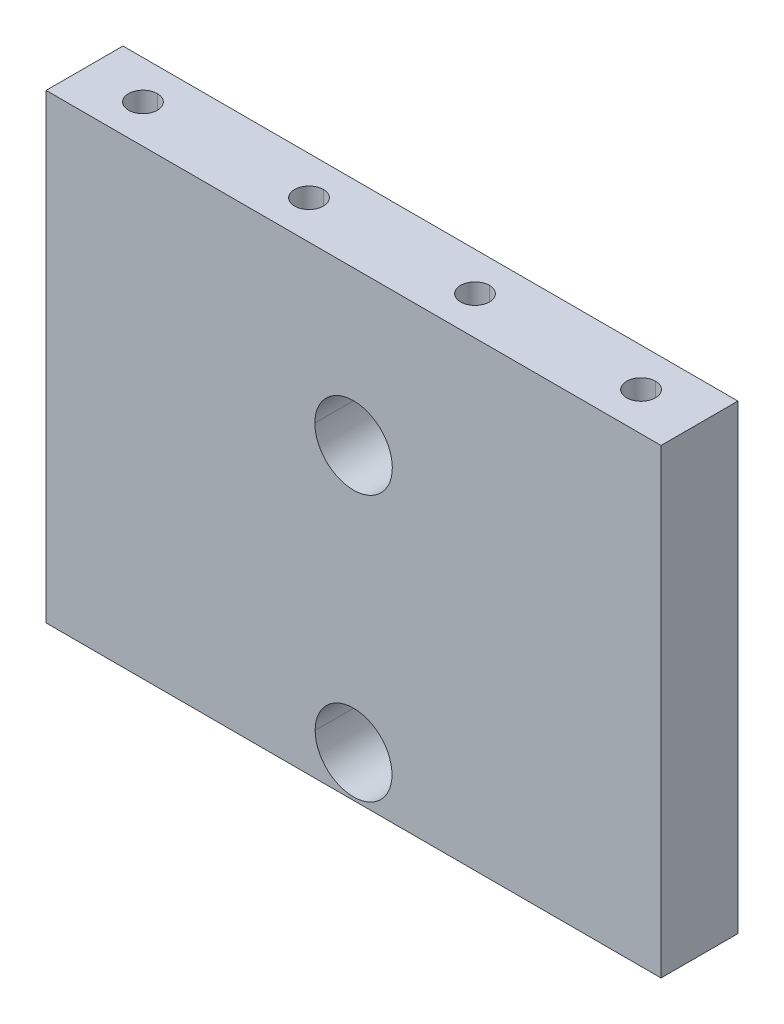
ISO-10303-21;
HEADER;
FILE_DESCRIPTION(('STEP AP214'),'2;1');
FILE_NAME('part.step','',(''),(''),'','','');
FILE_SCHEMA(('AUTOMOTIVE_DESIGN { 1 0 10303 214 1 1 1 1 }'));
ENDSEC;
DATA;
#1=APPLICATION_CONTEXT('core data for automotive mechanical design processes');
#2=APPLICATION_PROTOCOL_DEFINITION('international standard','automotive_design',2000,#1);
#3=PRODUCT_CONTEXT('',#1,'mechanical');
#4=PRODUCT('Part','Part','',(#3));
#5=PRODUCT_RELATED_PRODUCT_CATEGORY('part','',(#4));
#6=PRODUCT_DEFINITION_FORMATION('','',#4);
#7=PRODUCT_DEFINITION_CONTEXT('part definition',#1,'design');
#8=PRODUCT_DEFINITION('design','',#6,#7);
#9=PRODUCT_DEFINITION_SHAPE('','',#8);
#10=(LENGTH_UNIT() NAMED_UNIT(*) SI_UNIT(.MILLI.,.METRE.));
#11=(NAMED_UNIT(*) PLANE_ANGLE_UNIT() SI_UNIT($,.RADIAN.));
#12=(NAMED_UNIT(*) SI_UNIT($,.STERADIAN.) SOLID_ANGLE_UNIT());
#13=UNCERTAINTY_MEASURE_WITH_UNIT(LENGTH_MEASURE(1.E-05),#10,'distance_accuracy_value','');
#14=(GEOMETRIC_REPRESENTATION_CONTEXT(3) GLOBAL_UNCERTAINTY_ASSIGNED_CONTEXT((#13)) GLOBAL_UNIT_ASSIGNED_CONTEXT((#10,
#11,#12)) REPRESENTATION_CONTEXT('',''));
#15=CARTESIAN_POINT('',(0.,0.,0.));
#16=DIRECTION('',(0.,0.,1.));
#17=DIRECTION('',(1.,0.,0.));
#18=AXIS2_PLACEMENT_3D('',#15,#16,#17);
#19=CARTESIAN_POINT('',(0.,-7.8105,1.5875));
#20=DIRECTION('',(0.,0.,1.));
#21=DIRECTION('',(1.,0.,0.));
#22=AXIS2_PLACEMENT_3D('',#19,#20,#21);
#23=CYLINDRICAL_SURFACE('',#22,1.5875);
#24=CARTESIAN_POINT('',(0.,-7.8105,-1.5875));
#25=DIRECTION('',(0.,0.,1.));
#26=DIRECTION('',(1.,0.,0.));
#27=AXIS2_PLACEMENT_3D('',#24,#25,#26);
#28=CIRCLE('',#27,1.5875);
#29=CARTESIAN_POINT('',(-1.5875,-7.8105,-1.5875));
#30=VERTEX_POINT('',#29);
#31=CARTESIAN_POINT('',(1.5875,-7.8105,-1.5875));
#32=VERTEX_POINT('',#31);
#33=EDGE_CURVE('E41',#30,#32,#28,.T.);
#34=ORIENTED_EDGE('',*,*,#33,.F.);
#35=DIRECTION('',(0.,0.,1.));
#36=VECTOR('',#35,1.);
#37=CARTESIAN_POINT('',(-1.5875,-7.8105,1.5875));
#38=LINE('',#37,#36);
#39=CARTESIAN_POINT('',(-1.5875,-7.8105,1.5875));
#40=VERTEX_POINT('',#39);
#41=EDGE_CURVE('E11',#30,#40,#38,.T.);
#42=ORIENTED_EDGE('',*,*,#41,.T.);
#43=CARTESIAN_POINT('',(0.,-7.8105,1.5875));
#44=DIRECTION('',(0.,0.,1.));
#45=DIRECTION('',(1.,0.,0.));
#46=AXIS2_PLACEMENT_3D('',#43,#44,#45);
#47=CIRCLE('',#46,1.5875);
#48=CARTESIAN_POINT('',(1.5875,-7.8105,1.5875));
#49=VERTEX_POINT('',#48);
#50=EDGE_CURVE('E27',#40,#49,#47,.T.);
#51=ORIENTED_EDGE('',*,*,#50,.T.);
#52=DIRECTION('',(0.,0.,1.));
#53=VECTOR('',#52,1.);
#54=CARTESIAN_POINT('',(1.5875,-7.8105,1.5875));
#55=LINE('',#54,#53);
#56=EDGE_CURVE('E405',#32,#49,#55,.T.);
#57=ORIENTED_EDGE('',*,*,#56,.F.);
#58=EDGE_LOOP('',(#34,#42,#51,#57));
#59=FACE_BOUND('',#58,.T.);
#60=ADVANCED_FACE('F17',(#59),#23,.F.);
#61=CARTESIAN_POINT('',(-10.287,-9.525,0.));
#62=DIRECTION('',(0.,-1.,0.));
#63=DIRECTION('',(0.,0.,-1.));
#64=AXIS2_PLACEMENT_3D('',#61,#62,#63);
#65=CYLINDRICAL_SURFACE('',#64,0.59563);
#66=CARTESIAN_POINT('',(-10.287,-5.5118,0.));
#67=DIRECTION('',(0.,-1.,0.));
#68=DIRECTION('',(0.,0.,-1.));
#69=AXIS2_PLACEMENT_3D('',#66,#67,#68);
#70=CIRCLE('',#69,0.59563);
#71=CARTESIAN_POINT('',(-10.287,-5.5118,0.59563));
#72=VERTEX_POINT('',#71);
#73=CARTESIAN_POINT('',(-10.287,-5.5118,-0.59563));
#74=VERTEX_POINT('',#73);
#75=EDGE_CURVE('E421',#72,#74,#70,.T.);
#76=ORIENTED_EDGE('',*,*,#75,.F.);
#77=DIRECTION('',(0.,-1.,0.));
#78=VECTOR('',#77,1.);
#79=CARTESIAN_POINT('',(-10.287,-9.525,0.59563));
#80=LINE('',#79,#78);
#81=CARTESIAN_POINT('',(-10.287,-9.525,0.59563));
#82=VERTEX_POINT('',#81);
#83=EDGE_CURVE('E344',#72,#82,#80,.T.);
#84=ORIENTED_EDGE('',*,*,#83,.T.);
#85=CARTESIAN_POINT('',(-10.287,-9.525,0.));
#86=DIRECTION('',(0.,-1.,0.));
#87=DIRECTION('',(0.,0.,-1.));
#88=AXIS2_PLACEMENT_3D('',#85,#86,#87);
#89=CIRCLE('',#88,0.59563);
#90=CARTESIAN_POINT('',(-10.287,-9.525,-0.59563));
#91=VERTEX_POINT('',#90);
#92=EDGE_CURVE('E532',#82,#91,#89,.T.);
#93=ORIENTED_EDGE('',*,*,#92,.T.);
#94=DIRECTION('',(0.,-1.,0.));
#95=VECTOR('',#94,1.);
#96=CARTESIAN_POINT('',(-10.287,-9.525,-0.59563));
#97=LINE('',#96,#95);
#98=EDGE_CURVE('E572',#74,#91,#97,.T.);
#99=ORIENTED_EDGE('',*,*,#98,.F.);
#100=EDGE_LOOP('',(#76,#84,#93,#99));
#101=FACE_BOUND('',#100,.T.);
#102=ADVANCED_FACE('F644',(#101),#65,.F.);
#103=CARTESIAN_POINT('',(-10.287,-5.5118,0.));
#104=DIRECTION('',(0.,-1.,0.));
#105=DIRECTION('',(0.,0.,-1.));
#106=AXIS2_PLACEMENT_3D('',#103,#104,#105);
#107=CONICAL_SURFACE('',#106,0.59563,1.02974425867665);
#108=DIRECTION('',(0.,-0.515038074910057,-0.857167300702111));
#109=VECTOR('',#108,1.);
#110=CARTESIAN_POINT('',(-10.287,-5.5118,-0.59563));
#111=LINE('',#110,#109);
#112=CARTESIAN_POINT('',(-10.287,-5.15390938948862,0.));
#113=VERTEX_POINT('',#112);
#114=EDGE_CURVE('E248',#113,#74,#111,.T.);
#115=ORIENTED_EDGE('',*,*,#114,.F.);
#116=DIRECTION('',(0.,-0.515038074910057,0.857167300702111));
#117=VECTOR('',#116,1.);
#118=CARTESIAN_POINT('',(-10.287,-5.5118,0.59563));
#119=LINE('',#118,#117);
#120=EDGE_CURVE('E479',#113,#72,#119,.T.);
#121=ORIENTED_EDGE('',*,*,#120,.T.);
#122=ORIENTED_EDGE('',*,*,#75,.T.);
#123=EDGE_LOOP('',(#115,#121,#122));
#124=FACE_BOUND('',#123,.T.);
#125=ADVANCED_FACE('F649',(#124),#107,.F.);
#126=CARTESIAN_POINT('',(-3.429,-9.525,0.));
#127=DIRECTION('',(0.,-1.,0.));
#128=DIRECTION('',(0.,0.,-1.));
#129=AXIS2_PLACEMENT_3D('',#126,#127,#128);
#130=CYLINDRICAL_SURFACE('',#129,0.59563);
#131=CARTESIAN_POINT('',(-3.429,-5.5118,0.));
#132=DIRECTION('',(0.,-1.,0.));
#133=DIRECTION('',(0.,0.,-1.));
#134=AXIS2_PLACEMENT_3D('',#131,#132,#133);
#135=CIRCLE('',#134,0.59563);
#136=CARTESIAN_POINT('',(-3.429,-5.5118,0.59563));
#137=VERTEX_POINT('',#136);
#138=CARTESIAN_POINT('',(-3.429,-5.5118,-0.59563));
#139=VERTEX_POINT('',#138);
#140=EDGE_CURVE('E264',#137,#139,#135,.T.);
#141=ORIENTED_EDGE('',*,*,#140,.F.);
#142=DIRECTION('',(0.,-1.,0.));
#143=VECTOR('',#142,1.);
#144=CARTESIAN_POINT('',(-3.429,-9.525,0.59563));
#145=LINE('',#144,#143);
#146=CARTESIAN_POINT('',(-3.429,-9.525,0.59563));
#147=VERTEX_POINT('',#146);
#148=EDGE_CURVE('E418',#137,#147,#145,.T.);
#149=ORIENTED_EDGE('',*,*,#148,.T.);
#150=CARTESIAN_POINT('',(-3.429,-9.525,0.));
#151=DIRECTION('',(0.,-1.,0.));
#152=DIRECTION('',(0.,0.,-1.));
#153=AXIS2_PLACEMENT_3D('',#150,#151,#152);
#154=CIRCLE('',#153,0.59563);
#155=CARTESIAN_POINT('',(-3.429,-9.525,-0.59563));
#156=VERTEX_POINT('',#155);
#157=EDGE_CURVE('E422',#147,#156,#154,.T.);
#158=ORIENTED_EDGE('',*,*,#157,.T.);
#159=DIRECTION('',(0.,-1.,0.));
#160=VECTOR('',#159,1.);
#161=CARTESIAN_POINT('',(-3.429,-9.525,-0.59563));
#162=LINE('',#161,#160);
#163=EDGE_CURVE('E437',#139,#156,#162,.T.);
#164=ORIENTED_EDGE('',*,*,#163,.F.);
#165=EDGE_LOOP('',(#141,#149,#158,#164));
#166=FACE_BOUND('',#165,.T.);
#167=ADVANCED_FACE('F656',(#166),#130,.F.);
#168=CARTESIAN_POINT('',(-3.429,-5.5118,0.));
#169=DIRECTION('',(0.,-1.,0.));
#170=DIRECTION('',(0.,0.,-1.));
#171=AXIS2_PLACEMENT_3D('',#168,#169,#170);
#172=CONICAL_SURFACE('',#171,0.59563,1.02974425867665);
#173=DIRECTION('',(0.,-0.515038074910056,-0.857167300702111));
#174=VECTOR('',#173,1.);
#175=CARTESIAN_POINT('',(-3.429,-5.5118,-0.59563));
#176=LINE('',#175,#174);
#177=CARTESIAN_POINT('',(-3.429,-5.15390938948862,0.));
#178=VERTEX_POINT('',#177);
#179=EDGE_CURVE('E476',#178,#139,#176,.T.);
#180=ORIENTED_EDGE('',*,*,#179,.F.);
#181=DIRECTION('',(0.,-0.515038074910056,0.857167300702111));
#182=VECTOR('',#181,1.);
#183=CARTESIAN_POINT('',(-3.429,-5.5118,0.59563));
#184=LINE('',#183,#182);
#185=EDGE_CURVE('E508',#178,#137,#184,.T.);
#186=ORIENTED_EDGE('',*,*,#185,.T.);
#187=ORIENTED_EDGE('',*,*,#140,.T.);
#188=EDGE_LOOP('',(#180,#186,#187));
#189=FACE_BOUND('',#188,.T.);
#190=ADVANCED_FACE('F717',(#189),#172,.F.);
#191=CARTESIAN_POINT('',(3.429,-9.525,0.));
#192=DIRECTION('',(0.,-1.,0.));
#193=DIRECTION('',(0.,0.,-1.));
#194=AXIS2_PLACEMENT_3D('',#191,#192,#193);
#195=CYLINDRICAL_SURFACE('',#194,0.59563);
#196=CARTESIAN_POINT('',(3.429,-5.5118,0.));
#197=DIRECTION('',(0.,-1.,0.));
#198=DIRECTION('',(0.,0.,-1.));
#199=AXIS2_PLACEMENT_3D('',#196,#197,#198);
#200=CIRCLE('',#199,0.59563);
#201=CARTESIAN_POINT('',(3.429,-5.5118,0.59563));
#202=VERTEX_POINT('',#201);
#203=CARTESIAN_POINT('',(3.429,-5.5118,-0.59563));
#204=VERTEX_POINT('',#203);
#205=EDGE_CURVE('E536',#202,#204,#200,.T.);
#206=ORIENTED_EDGE('',*,*,#205,.F.);
#207=DIRECTION('',(0.,-1.,0.));
#208=VECTOR('',#207,1.);
#209=CARTESIAN_POINT('',(3.429,-9.525,0.59563));
#210=LINE('',#209,#208);
#211=CARTESIAN_POINT('',(3.429,-9.525,0.59563));
#212=VERTEX_POINT('',#211);
#213=EDGE_CURVE('E509',#202,#212,#210,.T.);
#214=ORIENTED_EDGE('',*,*,#213,.T.);
#215=CARTESIAN_POINT('',(3.429,-9.525,0.));
#216=DIRECTION('',(0.,-1.,0.));
#217=DIRECTION('',(0.,0.,-1.));
#218=AXIS2_PLACEMENT_3D('',#215,#216,#217);
#219=CIRCLE('',#218,0.59563);
#220=CARTESIAN_POINT('',(3.429,-9.525,-0.59563));
#221=VERTEX_POINT('',#220);
#222=EDGE_CURVE('E20',#212,#221,#219,.T.);
#223=ORIENTED_EDGE('',*,*,#222,.T.);
#224=DIRECTION('',(0.,-1.,0.));
#225=VECTOR('',#224,1.);
#226=CARTESIAN_POINT('',(3.429,-9.525,-0.59563));
#227=LINE('',#226,#225);
#228=EDGE_CURVE('E152',#204,#221,#227,.T.);
#229=ORIENTED_EDGE('',*,*,#228,.F.);
#230=EDGE_LOOP('',(#206,#214,#223,#229));
#231=FACE_BOUND('',#230,.T.);
#232=ADVANCED_FACE('F601',(#231),#195,.F.);
#233=CARTESIAN_POINT('',(3.429,-5.5118,0.));
#234=DIRECTION('',(0.,-1.,0.));
#235=DIRECTION('',(0.,0.,-1.));
#236=AXIS2_PLACEMENT_3D('',#233,#234,#235);
#237=CONICAL_SURFACE('',#236,0.59563,1.02974425867665);
#238=DIRECTION('',(0.,-0.515038074910056,-0.857167300702111));
#239=VECTOR('',#238,1.);
#240=CARTESIAN_POINT('',(3.429,-5.5118,-0.59563));
#241=LINE('',#240,#239);
#242=CARTESIAN_POINT('',(3.429,-5.15390938948862,0.));
#243=VERTEX_POINT('',#242);
#244=EDGE_CURVE('E582',#243,#204,#241,.T.);
#245=ORIENTED_EDGE('',*,*,#244,.F.);
#246=DIRECTION('',(0.,-0.515038074910056,0.857167300702111));
#247=VECTOR('',#246,1.);
#248=CARTESIAN_POINT('',(3.429,-5.5118,0.59563));
#249=LINE('',#248,#247);
#250=EDGE_CURVE('E533',#243,#202,#249,.T.);
#251=ORIENTED_EDGE('',*,*,#250,.T.);
#252=ORIENTED_EDGE('',*,*,#205,.T.);
#253=EDGE_LOOP('',(#245,#251,#252));
#254=FACE_BOUND('',#253,.T.);
#255=ADVANCED_FACE('F716',(#254),#237,.F.);
#256=CARTESIAN_POINT('',(10.287,-9.525,0.));
#257=DIRECTION('',(0.,-1.,0.));
#258=DIRECTION('',(0.,0.,-1.));
#259=AXIS2_PLACEMENT_3D('',#256,#257,#258);
#260=CYLINDRICAL_SURFACE('',#259,0.59563);
#261=CARTESIAN_POINT('',(10.287,-5.5118,0.));
#262=DIRECTION('',(0.,-1.,0.));
#263=DIRECTION('',(0.,0.,-1.));
#264=AXIS2_PLACEMENT_3D('',#261,#262,#263);
#265=CIRCLE('',#264,0.59563);
#266=CARTESIAN_POINT('',(10.287,-5.5118,0.59563));
#267=VERTEX_POINT('',#266);
#268=CARTESIAN_POINT('',(10.287,-5.5118,-0.59563));
#269=VERTEX_POINT('',#268);
#270=EDGE_CURVE('E349',#267,#269,#265,.T.);
#271=ORIENTED_EDGE('',*,*,#270,.F.);
#272=DIRECTION('',(0.,-1.,0.));
#273=VECTOR('',#272,1.);
#274=CARTESIAN_POINT('',(10.287,-9.525,0.59563));
#275=LINE('',#274,#273);
#276=CARTESIAN_POINT('',(10.287,-9.525,0.59563));
#277=VERTEX_POINT('',#276);
#278=EDGE_CURVE('E524',#267,#277,#275,.T.);
#279=ORIENTED_EDGE('',*,*,#278,.T.);
#280=CARTESIAN_POINT('',(10.287,-9.525,0.));
#281=DIRECTION('',(0.,-1.,0.));
#282=DIRECTION('',(0.,0.,-1.));
#283=AXIS2_PLACEMENT_3D('',#280,#281,#282);
#284=CIRCLE('',#283,0.59563);
#285=CARTESIAN_POINT('',(10.287,-9.525,-0.59563));
#286=VERTEX_POINT('',#285);
#287=EDGE_CURVE('E520',#277,#286,#284,.T.);
#288=ORIENTED_EDGE('',*,*,#287,.T.);
#289=DIRECTION('',(0.,-1.,0.));
#290=VECTOR('',#289,1.);
#291=CARTESIAN_POINT('',(10.287,-9.525,-0.59563));
#292=LINE('',#291,#290);
#293=EDGE_CURVE('E381',#269,#286,#292,.T.);
#294=ORIENTED_EDGE('',*,*,#293,.F.);
#295=EDGE_LOOP('',(#271,#279,#288,#294));
#296=FACE_BOUND('',#295,.T.);
#297=ADVANCED_FACE('F621',(#296),#260,.F.);
#298=CARTESIAN_POINT('',(10.287,-5.5118,0.));
#299=DIRECTION('',(0.,-1.,0.));
#300=DIRECTION('',(0.,0.,-1.));
#301=AXIS2_PLACEMENT_3D('',#298,#299,#300);
#302=CONICAL_SURFACE('',#301,0.59563,1.02974425867665);
#303=DIRECTION('',(0.,-0.515038074910057,-0.857167300702111));
#304=VECTOR('',#303,1.);
#305=CARTESIAN_POINT('',(10.287,-5.5118,-0.59563));
#306=LINE('',#305,#304);
#307=CARTESIAN_POINT('',(10.287,-5.15390938948862,0.));
#308=VERTEX_POINT('',#307);
#309=EDGE_CURVE('E380',#308,#269,#306,.T.);
#310=ORIENTED_EDGE('',*,*,#309,.F.);
#311=DIRECTION('',(0.,-0.515038074910057,0.857167300702111));
#312=VECTOR('',#311,1.);
#313=CARTESIAN_POINT('',(10.287,-5.5118,0.59563));
#314=LINE('',#313,#312);
#315=EDGE_CURVE('E394',#308,#267,#314,.T.);
#316=ORIENTED_EDGE('',*,*,#315,.T.);
#317=ORIENTED_EDGE('',*,*,#270,.T.);
#318=EDGE_LOOP('',(#310,#316,#317));
#319=FACE_BOUND('',#318,.T.);
#320=ADVANCED_FACE('F624',(#319),#302,.F.);
#321=CARTESIAN_POINT('',(0.,3.175,-1.5875));
#322=DIRECTION('',(0.,0.,1.));
#323=DIRECTION('',(1.,0.,0.));
#324=AXIS2_PLACEMENT_3D('',#321,#322,#323);
#325=CYLINDRICAL_SURFACE('',#324,1.6002);
#326=CARTESIAN_POINT('',(0.,3.175,-1.5875));
#327=DIRECTION('',(0.,0.,1.));
#328=DIRECTION('',(1.,0.,0.));
#329=AXIS2_PLACEMENT_3D('',#326,#327,#328);
#330=CIRCLE('',#329,1.6002);
#331=CARTESIAN_POINT('',(-1.6002,3.175,-1.5875));
#332=VERTEX_POINT('',#331);
#333=CARTESIAN_POINT('',(1.6002,3.175,-1.5875));
#334=VERTEX_POINT('',#333);
#335=EDGE_CURVE('E395',#332,#334,#330,.T.);
#336=ORIENTED_EDGE('',*,*,#335,.F.);
#337=DIRECTION('',(0.,0.,1.));
#338=VECTOR('',#337,1.);
#339=CARTESIAN_POINT('',(-1.6002,3.175,-1.5875));
#340=LINE('',#339,#338);
#341=CARTESIAN_POINT('',(-1.6002,3.175,1.5875));
#342=VERTEX_POINT('',#341);
#343=EDGE_CURVE('E345',#332,#342,#340,.T.);
#344=ORIENTED_EDGE('',*,*,#343,.T.);
#345=CARTESIAN_POINT('',(0.,3.175,1.5875));
#346=DIRECTION('',(0.,0.,1.));
#347=DIRECTION('',(1.,0.,0.));
#348=AXIS2_PLACEMENT_3D('',#345,#346,#347);
#349=CIRCLE('',#348,1.6002);
#350=CARTESIAN_POINT('',(1.6002,3.175,1.5875));
#351=VERTEX_POINT('',#350);
#352=EDGE_CURVE('E350',#342,#351,#349,.T.);
#353=ORIENTED_EDGE('',*,*,#352,.T.);
#354=DIRECTION('',(0.,0.,1.));
#355=VECTOR('',#354,1.);
#356=CARTESIAN_POINT('',(1.6002,3.175,-1.5875));
#357=LINE('',#356,#355);
#358=EDGE_CURVE('E382',#334,#351,#357,.T.);
#359=ORIENTED_EDGE('',*,*,#358,.F.);
#360=EDGE_LOOP('',(#336,#344,#353,#359));
#361=FACE_BOUND('',#360,.T.);
#362=ADVANCED_FACE('F662',(#361),#325,.F.);
#363=CARTESIAN_POINT('',(-10.287,9.525,0.));
#364=DIRECTION('',(0.,1.,0.));
#365=DIRECTION('',(0.,0.,1.));
#366=AXIS2_PLACEMENT_3D('',#363,#364,#365);
#367=CYLINDRICAL_SURFACE('',#366,0.59563);
#368=CARTESIAN_POINT('',(-10.287,5.5118,0.));
#369=DIRECTION('',(0.,1.,0.));
#370=DIRECTION('',(0.,0.,1.));
#371=AXIS2_PLACEMENT_3D('',#368,#369,#370);
#372=CIRCLE('',#371,0.59563);
#373=CARTESIAN_POINT('',(-10.287,5.5118,-0.59563));
#374=VERTEX_POINT('',#373);
#375=CARTESIAN_POINT('',(-10.287,5.5118,0.59563));
#376=VERTEX_POINT('',#375);
#377=EDGE_CURVE('E530',#374,#376,#372,.T.);
#378=ORIENTED_EDGE('',*,*,#377,.F.);
#379=DIRECTION('',(0.,1.,0.));
#380=VECTOR('',#379,1.);
#381=CARTESIAN_POINT('',(-10.287,9.525,-0.59563));
#382=LINE('',#381,#380);
#383=CARTESIAN_POINT('',(-10.287,9.525,-0.59563));
#384=VERTEX_POINT('',#383);
#385=EDGE_CURVE('E340',#374,#384,#382,.T.);
#386=ORIENTED_EDGE('',*,*,#385,.T.);
#387=CARTESIAN_POINT('',(-10.287,9.525,0.));
#388=DIRECTION('',(0.,1.,0.));
#389=DIRECTION('',(0.,0.,1.));
#390=AXIS2_PLACEMENT_3D('',#387,#388,#389);
#391=CIRCLE('',#390,0.59563);
#392=CARTESIAN_POINT('',(-10.287,9.525,0.59563));
#393=VERTEX_POINT('',#392);
#394=EDGE_CURVE('E529',#384,#393,#391,.T.);
#395=ORIENTED_EDGE('',*,*,#394,.T.);
#396=DIRECTION('',(0.,1.,0.));
#397=VECTOR('',#396,1.);
#398=CARTESIAN_POINT('',(-10.287,9.525,0.59563));
#399=LINE('',#398,#397);
#400=EDGE_CURVE('E448',#376,#393,#399,.T.);
#401=ORIENTED_EDGE('',*,*,#400,.F.);
#402=EDGE_LOOP('',(#378,#386,#395,#401));
#403=FACE_BOUND('',#402,.T.);
#404=ADVANCED_FACE('F665',(#403),#367,.F.);
#405=CARTESIAN_POINT('',(-10.287,5.5118,0.));
#406=DIRECTION('',(0.,1.,0.));
#407=DIRECTION('',(0.,0.,1.));
#408=AXIS2_PLACEMENT_3D('',#405,#406,#407);
#409=CONICAL_SURFACE('',#408,0.59563,1.02974425867665);
#410=DIRECTION('',(0.,0.515038074910057,0.857167300702111));
#411=VECTOR('',#410,1.);
#412=CARTESIAN_POINT('',(-10.287,5.5118,0.59563));
#413=LINE('',#412,#411);
#414=CARTESIAN_POINT('',(-10.287,5.15390938948861,0.));
#415=VERTEX_POINT('',#414);
#416=EDGE_CURVE('E447',#415,#376,#413,.T.);
#417=ORIENTED_EDGE('',*,*,#416,.F.);
#418=DIRECTION('',(0.,0.515038074910057,-0.857167300702111));
#419=VECTOR('',#418,1.);
#420=CARTESIAN_POINT('',(-10.287,5.5118,-0.59563));
#421=LINE('',#420,#419);
#422=EDGE_CURVE('E525',#415,#374,#421,.T.);
#423=ORIENTED_EDGE('',*,*,#422,.T.);
#424=ORIENTED_EDGE('',*,*,#377,.T.);
#425=EDGE_LOOP('',(#417,#423,#424));
#426=FACE_BOUND('',#425,.T.);
#427=ADVANCED_FACE('F667',(#426),#409,.F.);
#428=CARTESIAN_POINT('',(-3.429,9.525,0.));
#429=DIRECTION('',(0.,1.,0.));
#430=DIRECTION('',(0.,0.,1.));
#431=AXIS2_PLACEMENT_3D('',#428,#429,#430);
#432=CYLINDRICAL_SURFACE('',#431,0.59563);
#433=CARTESIAN_POINT('',(-3.429,5.5118,0.));
#434=DIRECTION('',(0.,1.,0.));
#435=DIRECTION('',(0.,0.,1.));
#436=AXIS2_PLACEMENT_3D('',#433,#434,#435);
#437=CIRCLE('',#436,0.59563);
#438=CARTESIAN_POINT('',(-3.429,5.5118,-0.59563));
#439=VERTEX_POINT('',#438);
#440=CARTESIAN_POINT('',(-3.429,5.5118,0.59563));
#441=VERTEX_POINT('',#440);
#442=EDGE_CURVE('E324',#439,#441,#437,.T.);
#443=ORIENTED_EDGE('',*,*,#442,.F.);
#444=DIRECTION('',(0.,1.,0.));
#445=VECTOR('',#444,1.);
#446=CARTESIAN_POINT('',(-3.429,9.525,-0.59563));
#447=LINE('',#446,#445);
#448=CARTESIAN_POINT('',(-3.429,9.525,-0.59563));
#449=VERTEX_POINT('',#448);
#450=EDGE_CURVE('E370',#439,#449,#447,.T.);
#451=ORIENTED_EDGE('',*,*,#450,.T.);
#452=CARTESIAN_POINT('',(-3.429,9.525,0.));
#453=DIRECTION('',(0.,1.,0.));
#454=DIRECTION('',(0.,0.,1.));
#455=AXIS2_PLACEMENT_3D('',#452,#453,#454);
#456=CIRCLE('',#455,0.59563);
#457=CARTESIAN_POINT('',(-3.429,9.525,0.59563));
#458=VERTEX_POINT('',#457);
#459=EDGE_CURVE('E366',#449,#458,#456,.T.);
#460=ORIENTED_EDGE('',*,*,#459,.T.);
#461=DIRECTION('',(0.,1.,0.));
#462=VECTOR('',#461,1.);
#463=CARTESIAN_POINT('',(-3.429,9.525,0.59563));
#464=LINE('',#463,#462);
#465=EDGE_CURVE('E351',#441,#458,#464,.T.);
#466=ORIENTED_EDGE('',*,*,#465,.F.);
#467=EDGE_LOOP('',(#443,#451,#460,#466));
#468=FACE_BOUND('',#467,.T.);
#469=ADVANCED_FACE('F669',(#468),#432,.F.);
#470=CARTESIAN_POINT('',(-3.429,5.5118,0.));
#471=DIRECTION('',(0.,1.,0.));
#472=DIRECTION('',(0.,0.,1.));
#473=AXIS2_PLACEMENT_3D('',#470,#471,#472);
#474=CONICAL_SURFACE('',#473,0.59563,1.02974425867665);
#475=DIRECTION('',(0.,0.515038074910056,0.857167300702111));
#476=VECTOR('',#475,1.);
#477=CARTESIAN_POINT('',(-3.429,5.5118,0.59563));
#478=LINE('',#477,#476);
#479=CARTESIAN_POINT('',(-3.429,5.15390938948861,0.));
#480=VERTEX_POINT('',#479);
#481=EDGE_CURVE('E375',#480,#441,#478,.T.);
#482=ORIENTED_EDGE('',*,*,#481,.F.);
#483=DIRECTION('',(0.,0.515038074910056,-0.857167300702111));
#484=VECTOR('',#483,1.);
#485=CARTESIAN_POINT('',(-3.429,5.5118,-0.59563));
#486=LINE('',#485,#484);
#487=EDGE_CURVE('E371',#480,#439,#486,.T.);
#488=ORIENTED_EDGE('',*,*,#487,.T.);
#489=ORIENTED_EDGE('',*,*,#442,.T.);
#490=EDGE_LOOP('',(#482,#488,#489));
#491=FACE_BOUND('',#490,.T.);
#492=ADVANCED_FACE('F672',(#491),#474,.F.);
#493=CARTESIAN_POINT('',(3.429,9.525,0.));
#494=DIRECTION('',(0.,1.,0.));
#495=DIRECTION('',(0.,0.,1.));
#496=AXIS2_PLACEMENT_3D('',#493,#494,#495);
#497=CYLINDRICAL_SURFACE('',#496,0.59563);
#498=CARTESIAN_POINT('',(3.429,5.5118,0.));
#499=DIRECTION('',(0.,1.,0.));
#500=DIRECTION('',(0.,0.,1.));
#501=AXIS2_PLACEMENT_3D('',#498,#499,#500);
#502=CIRCLE('',#501,0.59563);
#503=CARTESIAN_POINT('',(3.429,5.5118,-0.59563));
#504=VERTEX_POINT('',#503);
#505=CARTESIAN_POINT('',(3.429,5.5118,0.59563));
#506=VERTEX_POINT('',#505);
#507=EDGE_CURVE('E294',#504,#506,#502,.T.);
#508=ORIENTED_EDGE('',*,*,#507,.F.);
#509=DIRECTION('',(0.,1.,0.));
#510=VECTOR('',#509,1.);
#511=CARTESIAN_POINT('',(3.429,9.525,-0.59563));
#512=LINE('',#511,#510);
#513=CARTESIAN_POINT('',(3.429,9.525,-0.59563));
#514=VERTEX_POINT('',#513);
#515=EDGE_CURVE('E299',#504,#514,#512,.T.);
#516=ORIENTED_EDGE('',*,*,#515,.T.);
#517=CARTESIAN_POINT('',(3.429,9.525,0.));
#518=DIRECTION('',(0.,1.,0.));
#519=DIRECTION('',(0.,0.,1.));
#520=AXIS2_PLACEMENT_3D('',#517,#518,#519);
#521=CIRCLE('',#520,0.59563);
#522=CARTESIAN_POINT('',(3.429,9.525,0.59563));
#523=VERTEX_POINT('',#522);
#524=EDGE_CURVE('E316',#514,#523,#521,.T.);
#525=ORIENTED_EDGE('',*,*,#524,.T.);
#526=DIRECTION('',(0.,1.,0.));
#527=VECTOR('',#526,1.);
#528=CARTESIAN_POINT('',(3.429,9.525,0.59563));
#529=LINE('',#528,#527);
#530=EDGE_CURVE('E301',#506,#523,#529,.T.);
#531=ORIENTED_EDGE('',*,*,#530,.F.);
#532=EDGE_LOOP('',(#508,#516,#525,#531));
#533=FACE_BOUND('',#532,.T.);
#534=ADVANCED_FACE('F296',(#533),#497,.F.);
#535=CARTESIAN_POINT('',(3.429,5.5118,0.));
#536=DIRECTION('',(0.,1.,0.));
#537=DIRECTION('',(0.,0.,1.));
#538=AXIS2_PLACEMENT_3D('',#535,#536,#537);
#539=CONICAL_SURFACE('',#538,0.59563,1.02974425867665);
#540=DIRECTION('',(0.,0.515038074910056,0.857167300702111));
#541=VECTOR('',#540,1.);
#542=CARTESIAN_POINT('',(3.429,5.5118,0.59563));
#543=LINE('',#542,#541);
#544=CARTESIAN_POINT('',(3.429,5.15390938948861,0.));
#545=VERTEX_POINT('',#544);
#546=EDGE_CURVE('E312',#545,#506,#543,.T.);
#547=ORIENTED_EDGE('',*,*,#546,.F.);
#548=DIRECTION('',(0.,0.515038074910056,-0.857167300702111));
#549=VECTOR('',#548,1.);
#550=CARTESIAN_POINT('',(3.429,5.5118,-0.59563));
#551=LINE('',#550,#549);
#552=EDGE_CURVE('E307',#545,#504,#551,.T.);
#553=ORIENTED_EDGE('',*,*,#552,.T.);
#554=ORIENTED_EDGE('',*,*,#507,.T.);
#555=EDGE_LOOP('',(#547,#553,#554));
#556=FACE_BOUND('',#555,.T.);
#557=ADVANCED_FACE('F311',(#556),#539,.F.);
#558=CARTESIAN_POINT('',(10.287,9.525,0.));
#559=DIRECTION('',(0.,1.,0.));
#560=DIRECTION('',(0.,0.,1.));
#561=AXIS2_PLACEMENT_3D('',#558,#559,#560);
#562=CYLINDRICAL_SURFACE('',#561,0.59563);
#563=CARTESIAN_POINT('',(10.287,5.5118,0.));
#564=DIRECTION('',(0.,1.,0.));
#565=DIRECTION('',(0.,0.,1.));
#566=AXIS2_PLACEMENT_3D('',#563,#564,#565);
#567=CIRCLE('',#566,0.59563);
#568=CARTESIAN_POINT('',(10.287,5.5118,-0.59563));
#569=VERTEX_POINT('',#568);
#570=CARTESIAN_POINT('',(10.287,5.5118,0.59563));
#571=VERTEX_POINT('',#570);
#572=EDGE_CURVE('E364',#569,#571,#567,.T.);
#573=ORIENTED_EDGE('',*,*,#572,.F.);
#574=DIRECTION('',(0.,1.,0.));
#575=VECTOR('',#574,1.);
#576=CARTESIAN_POINT('',(10.287,9.525,-0.59563));
#577=LINE('',#576,#575);
#578=CARTESIAN_POINT('',(10.287,9.525,-0.59563));
#579=VERTEX_POINT('',#578);
#580=EDGE_CURVE('E308',#569,#579,#577,.T.);
#581=ORIENTED_EDGE('',*,*,#580,.T.);
#582=CARTESIAN_POINT('',(10.287,9.525,0.));
#583=DIRECTION('',(0.,1.,0.));
#584=DIRECTION('',(0.,0.,1.));
#585=AXIS2_PLACEMENT_3D('',#582,#583,#584);
#586=CIRCLE('',#585,0.59563);
#587=CARTESIAN_POINT('',(10.287,9.525,0.59563));
#588=VERTEX_POINT('',#587);
#589=EDGE_CURVE('E221',#579,#588,#586,.T.);
#590=ORIENTED_EDGE('',*,*,#589,.T.);
#591=DIRECTION('',(0.,1.,0.));
#592=VECTOR('',#591,1.);
#593=CARTESIAN_POINT('',(10.287,9.525,0.59563));
#594=LINE('',#593,#592);
#595=EDGE_CURVE('E210',#571,#588,#594,.T.);
#596=ORIENTED_EDGE('',*,*,#595,.F.);
#597=EDGE_LOOP('',(#573,#581,#590,#596));
#598=FACE_BOUND('',#597,.T.);
#599=ADVANCED_FACE('F678',(#598),#562,.F.);
#600=CARTESIAN_POINT('',(10.287,5.5118,0.));
#601=DIRECTION('',(0.,1.,0.));
#602=DIRECTION('',(0.,0.,1.));
#603=AXIS2_PLACEMENT_3D('',#600,#601,#602);
#604=CONICAL_SURFACE('',#603,0.59563,1.02974425867665);
#605=DIRECTION('',(0.,0.515038074910057,0.857167300702111));
#606=VECTOR('',#605,1.);
#607=CARTESIAN_POINT('',(10.287,5.5118,0.59563));
#608=LINE('',#607,#606);
#609=CARTESIAN_POINT('',(10.287,5.15390938948861,0.));
#610=VERTEX_POINT('',#609);
#611=EDGE_CURVE('E399',#610,#571,#608,.T.);
#612=ORIENTED_EDGE('',*,*,#611,.F.);
#613=DIRECTION('',(0.,0.515038074910057,-0.857167300702111));
#614=VECTOR('',#613,1.);
#615=CARTESIAN_POINT('',(10.287,5.5118,-0.59563));
#616=LINE('',#615,#614);
#617=EDGE_CURVE('E387',#610,#569,#616,.T.);
#618=ORIENTED_EDGE('',*,*,#617,.T.);
#619=ORIENTED_EDGE('',*,*,#572,.T.);
#620=EDGE_LOOP('',(#612,#618,#619));
#621=FACE_BOUND('',#620,.T.);
#622=ADVANCED_FACE('F690',(#621),#604,.F.);
#623=CARTESIAN_POINT('',(-12.7,9.525,1.5875));
#624=DIRECTION('',(0.,-1.,0.));
#625=DIRECTION('',(0.,0.,-1.));
#626=AXIS2_PLACEMENT_3D('',#623,#624,#625);
#627=PLANE('',#626);
#628=DIRECTION('',(-1.,0.,0.));
#629=VECTOR('',#628,1.);
#630=CARTESIAN_POINT('',(-12.7,9.525,-1.5875));
#631=LINE('',#630,#629);
#632=CARTESIAN_POINT('',(12.7,9.525,-1.5875));
#633=VERTEX_POINT('',#632);
#634=CARTESIAN_POINT('',(-12.7,9.525,-1.5875));
#635=VERTEX_POINT('',#634);
#636=EDGE_CURVE('E360',#633,#635,#631,.T.);
#637=ORIENTED_EDGE('',*,*,#636,.T.);
#638=DIRECTION('',(0.,0.,-1.));
#639=VECTOR('',#638,1.);
#640=CARTESIAN_POINT('',(-12.7,9.525,1.5875));
#641=LINE('',#640,#639);
#642=CARTESIAN_POINT('',(-12.7,9.525,1.5875));
#643=VERTEX_POINT('',#642);
#644=EDGE_CURVE('E416',#643,#635,#641,.T.);
#645=ORIENTED_EDGE('',*,*,#644,.F.);
#646=DIRECTION('',(-1.,0.,0.));
#647=VECTOR('',#646,1.);
#648=CARTESIAN_POINT('',(-12.7,9.525,1.5875));
#649=LINE('',#648,#647);
#650=CARTESIAN_POINT('',(12.7,9.525,1.5875));
#651=VERTEX_POINT('',#650);
#652=EDGE_CURVE('E472',#651,#643,#649,.T.);
#653=ORIENTED_EDGE('',*,*,#652,.F.);
#654=DIRECTION('',(0.,0.,-1.));
#655=VECTOR('',#654,1.);
#656=CARTESIAN_POINT('',(12.7,9.525,1.5875));
#657=LINE('',#656,#655);
#658=EDGE_CURVE('E365',#651,#633,#657,.T.);
#659=ORIENTED_EDGE('',*,*,#658,.T.);
#660=EDGE_LOOP('',(#637,#645,#653,#659));
#661=FACE_BOUND('',#660,.T.);
#662=CARTESIAN_POINT('',(-10.287,9.525,0.));
#663=DIRECTION('',(0.,1.,0.));
#664=DIRECTION('',(0.,0.,1.));
#665=AXIS2_PLACEMENT_3D('',#662,#663,#664);
#666=CIRCLE('',#665,0.59563);
#667=EDGE_CURVE('E384',#393,#384,#666,.T.);
#668=ORIENTED_EDGE('',*,*,#667,.F.);
#669=ORIENTED_EDGE('',*,*,#394,.F.);
#670=EDGE_LOOP('',(#668,#669));
#671=FACE_BOUND('',#670,.T.);
#672=CARTESIAN_POINT('',(-3.429,9.525,0.));
#673=DIRECTION('',(0.,1.,0.));
#674=DIRECTION('',(0.,0.,1.));
#675=AXIS2_PLACEMENT_3D('',#672,#673,#674);
#676=CIRCLE('',#675,0.59563);
#677=EDGE_CURVE('E355',#458,#449,#676,.T.);
#678=ORIENTED_EDGE('',*,*,#677,.F.);
#679=ORIENTED_EDGE('',*,*,#459,.F.);
#680=EDGE_LOOP('',(#678,#679));
#681=FACE_BOUND('',#680,.T.);
#682=CARTESIAN_POINT('',(3.429,9.525,0.));
#683=DIRECTION('',(0.,1.,0.));
#684=DIRECTION('',(0.,0.,1.));
#685=AXIS2_PLACEMENT_3D('',#682,#683,#684);
#686=CIRCLE('',#685,0.59563);
#687=EDGE_CURVE('E322',#523,#514,#686,.T.);
#688=ORIENTED_EDGE('',*,*,#687,.F.);
#689=ORIENTED_EDGE('',*,*,#524,.F.);
#690=EDGE_LOOP('',(#688,#689));
#691=FACE_BOUND('',#690,.T.);
#692=CARTESIAN_POINT('',(10.287,9.525,0.));
#693=DIRECTION('',(0.,1.,0.));
#694=DIRECTION('',(0.,0.,1.));
#695=AXIS2_PLACEMENT_3D('',#692,#693,#694);
#696=CIRCLE('',#695,0.59563);
#697=EDGE_CURVE('E334',#588,#579,#696,.T.);
#698=ORIENTED_EDGE('',*,*,#697,.F.);
#699=ORIENTED_EDGE('',*,*,#589,.F.);
#700=EDGE_LOOP('',(#698,#699));
#701=FACE_BOUND('',#700,.T.);
#702=ADVANCED_FACE('F693',(#661,#671,#681,#691,#701),#627,.F.);
#703=CARTESIAN_POINT('',(-12.7,9.525,1.5875));
#704=DIRECTION('',(1.,0.,0.));
#705=DIRECTION('',(0.,1.,0.));
#706=AXIS2_PLACEMENT_3D('',#703,#704,#705);
#707=PLANE('',#706);
#708=DIRECTION('',(0.,-1.,0.));
#709=VECTOR('',#708,1.);
#710=CARTESIAN_POINT('',(-12.7,9.525,-1.5875));
#711=LINE('',#710,#709);
#712=CARTESIAN_POINT('',(-12.7,-9.525,-1.5875));
#713=VERTEX_POINT('',#712);
#714=EDGE_CURVE('E494',#635,#713,#711,.T.);
#715=ORIENTED_EDGE('',*,*,#714,.T.);
#716=DIRECTION('',(0.,0.,-1.));
#717=VECTOR('',#716,1.);
#718=CARTESIAN_POINT('',(-12.7,-9.525,1.5875));
#719=LINE('',#718,#717);
#720=CARTESIAN_POINT('',(-12.7,-9.525,1.5875));
#721=VERTEX_POINT('',#720);
#722=EDGE_CURVE('E417',#721,#713,#719,.T.);
#723=ORIENTED_EDGE('',*,*,#722,.F.);
#724=DIRECTION('',(0.,-1.,0.));
#725=VECTOR('',#724,1.);
#726=CARTESIAN_POINT('',(-12.7,9.525,1.5875));
#727=LINE('',#726,#725);
#728=EDGE_CURVE('E429',#643,#721,#727,.T.);
#729=ORIENTED_EDGE('',*,*,#728,.F.);
#730=ORIENTED_EDGE('',*,*,#644,.T.);
#731=EDGE_LOOP('',(#715,#723,#729,#730));
#732=FACE_BOUND('',#731,.T.);
#733=ADVANCED_FACE('F609',(#732),#707,.F.);
#734=CARTESIAN_POINT('',(-12.7,-9.525,1.5875));
#735=DIRECTION('',(0.,1.,0.));
#736=DIRECTION('',(1.,0.,0.));
#737=AXIS2_PLACEMENT_3D('',#734,#735,#736);
#738=PLANE('',#737);
#739=DIRECTION('',(1.,0.,0.));
#740=VECTOR('',#739,1.);
#741=CARTESIAN_POINT('',(-12.7,-9.525,-1.5875));
#742=LINE('',#741,#740);
#743=CARTESIAN_POINT('',(12.7,-9.525,-1.5875));
#744=VERTEX_POINT('',#743);
#745=EDGE_CURVE('E412',#713,#744,#742,.T.);
#746=ORIENTED_EDGE('',*,*,#745,.T.);
#747=DIRECTION('',(0.,0.,-1.));
#748=VECTOR('',#747,1.);
#749=CARTESIAN_POINT('',(12.7,-9.525,1.5875));
#750=LINE('',#749,#748);
#751=CARTESIAN_POINT('',(12.7,-9.525,1.5875));
#752=VERTEX_POINT('',#751);
#753=EDGE_CURVE('E425',#752,#744,#750,.T.);
#754=ORIENTED_EDGE('',*,*,#753,.F.);
#755=DIRECTION('',(1.,0.,0.));
#756=VECTOR('',#755,1.);
#757=CARTESIAN_POINT('',(-12.7,-9.525,1.5875));
#758=LINE('',#757,#756);
#759=EDGE_CURVE('E480',#721,#752,#758,.T.);
#760=ORIENTED_EDGE('',*,*,#759,.F.);
#761=ORIENTED_EDGE('',*,*,#722,.T.);
#762=EDGE_LOOP('',(#746,#754,#760,#761));
#763=FACE_BOUND('',#762,.T.);
#764=CARTESIAN_POINT('',(-10.287,-9.525,0.));
#765=DIRECTION('',(0.,-1.,0.));
#766=DIRECTION('',(0.,0.,-1.));
#767=AXIS2_PLACEMENT_3D('',#764,#765,#766);
#768=CIRCLE('',#767,0.59563);
#769=EDGE_CURVE('E568',#91,#82,#768,.T.);
#770=ORIENTED_EDGE('',*,*,#769,.F.);
#771=ORIENTED_EDGE('',*,*,#92,.F.);
#772=EDGE_LOOP('',(#770,#771));
#773=FACE_BOUND('',#772,.T.);
#774=CARTESIAN_POINT('',(-3.429,-9.525,0.));
#775=DIRECTION('',(0.,-1.,0.));
#776=DIRECTION('',(0.,0.,-1.));
#777=AXIS2_PLACEMENT_3D('',#774,#775,#776);
#778=CIRCLE('',#777,0.59563);
#779=EDGE_CURVE('E441',#156,#147,#778,.T.);
#780=ORIENTED_EDGE('',*,*,#779,.F.);
#781=ORIENTED_EDGE('',*,*,#157,.F.);
#782=EDGE_LOOP('',(#780,#781));
#783=FACE_BOUND('',#782,.T.);
#784=CARTESIAN_POINT('',(3.429,-9.525,0.));
#785=DIRECTION('',(0.,-1.,0.));
#786=DIRECTION('',(0.,0.,-1.));
#787=AXIS2_PLACEMENT_3D('',#784,#785,#786);
#788=CIRCLE('',#787,0.59563);
#789=EDGE_CURVE('E359',#221,#212,#788,.T.);
#790=ORIENTED_EDGE('',*,*,#789,.F.);
#791=ORIENTED_EDGE('',*,*,#222,.F.);
#792=EDGE_LOOP('',(#790,#791));
#793=FACE_BOUND('',#792,.T.);
#794=CARTESIAN_POINT('',(10.287,-9.525,0.));
#795=DIRECTION('',(0.,-1.,0.));
#796=DIRECTION('',(0.,0.,-1.));
#797=AXIS2_PLACEMENT_3D('',#794,#795,#796);
#798=CIRCLE('',#797,0.59563);
#799=EDGE_CURVE('E578',#286,#277,#798,.T.);
#800=ORIENTED_EDGE('',*,*,#799,.F.);
#801=ORIENTED_EDGE('',*,*,#287,.F.);
#802=EDGE_LOOP('',(#800,#801));
#803=FACE_BOUND('',#802,.T.);
#804=ADVANCED_FACE('F605',(#763,#773,#783,#793,#803),#738,.F.);
#805=CARTESIAN_POINT('',(12.7,9.525,1.5875));
#806=DIRECTION('',(-1.,0.,0.));
#807=DIRECTION('',(0.,1.,0.));
#808=AXIS2_PLACEMENT_3D('',#805,#806,#807);
#809=PLANE('',#808);
#810=DIRECTION('',(0.,1.,0.));
#811=VECTOR('',#810,1.);
#812=CARTESIAN_POINT('',(12.7,9.525,-1.5875));
#813=LINE('',#812,#811);
#814=EDGE_CURVE('E428',#744,#633,#813,.T.);
#815=ORIENTED_EDGE('',*,*,#814,.T.);
#816=ORIENTED_EDGE('',*,*,#658,.F.);
#817=DIRECTION('',(0.,1.,0.));
#818=VECTOR('',#817,1.);
#819=CARTESIAN_POINT('',(12.7,9.525,1.5875));
#820=LINE('',#819,#818);
#821=EDGE_CURVE('E483',#752,#651,#820,.T.);
#822=ORIENTED_EDGE('',*,*,#821,.F.);
#823=ORIENTED_EDGE('',*,*,#753,.T.);
#824=EDGE_LOOP('',(#815,#816,#822,#823));
#825=FACE_BOUND('',#824,.T.);
#826=ADVANCED_FACE('F608',(#825),#809,.F.);
#827=CARTESIAN_POINT('',(-12.7,-9.525,1.5875));
#828=DIRECTION('',(0.,0.,1.));
#829=DIRECTION('',(1.,0.,0.));
#830=AXIS2_PLACEMENT_3D('',#827,#828,#829);
#831=PLANE('',#830);
#832=ORIENTED_EDGE('',*,*,#728,.T.);
#833=ORIENTED_EDGE('',*,*,#759,.T.);
#834=ORIENTED_EDGE('',*,*,#821,.T.);
#835=ORIENTED_EDGE('',*,*,#652,.T.);
#836=EDGE_LOOP('',(#832,#833,#834,#835));
#837=FACE_BOUND('',#836,.T.);
#838=CARTESIAN_POINT('',(0.,-7.8105,1.5875));
#839=DIRECTION('',(0.,0.,1.));
#840=DIRECTION('',(1.,0.,0.));
#841=AXIS2_PLACEMENT_3D('',#838,#839,#840);
#842=CIRCLE('',#841,1.5875);
#843=EDGE_CURVE('E401',#49,#40,#842,.T.);
#844=ORIENTED_EDGE('',*,*,#843,.F.);
#845=ORIENTED_EDGE('',*,*,#50,.F.);
#846=EDGE_LOOP('',(#844,#845));
#847=FACE_BOUND('',#846,.T.);
#848=CARTESIAN_POINT('',(0.,3.175,1.5875));
#849=DIRECTION('',(0.,0.,1.));
#850=DIRECTION('',(1.,0.,0.));
#851=AXIS2_PLACEMENT_3D('',#848,#849,#850);
#852=CIRCLE('',#851,1.6002);
#853=EDGE_CURVE('E385',#351,#342,#852,.T.);
#854=ORIENTED_EDGE('',*,*,#853,.F.);
#855=ORIENTED_EDGE('',*,*,#352,.F.);
#856=EDGE_LOOP('',(#854,#855));
#857=FACE_BOUND('',#856,.T.);
#858=ADVANCED_FACE('F719',(#837,#847,#857),#831,.T.);
#859=CARTESIAN_POINT('',(-12.7,-9.525,-1.5875));
#860=DIRECTION('',(0.,0.,1.));
#861=DIRECTION('',(1.,0.,0.));
#862=AXIS2_PLACEMENT_3D('',#859,#860,#861);
#863=PLANE('',#862);
#864=ORIENTED_EDGE('',*,*,#714,.F.);
#865=ORIENTED_EDGE('',*,*,#636,.F.);
#866=ORIENTED_EDGE('',*,*,#814,.F.);
#867=ORIENTED_EDGE('',*,*,#745,.F.);
#868=EDGE_LOOP('',(#864,#865,#866,#867));
#869=FACE_BOUND('',#868,.T.);
#870=CARTESIAN_POINT('',(0.,-7.8105,-1.5875));
#871=DIRECTION('',(0.,0.,1.));
#872=DIRECTION('',(1.,0.,0.));
#873=AXIS2_PLACEMENT_3D('',#870,#871,#872);
#874=CIRCLE('',#873,1.5875);
#875=EDGE_CURVE('E487',#32,#30,#874,.T.);
#876=ORIENTED_EDGE('',*,*,#875,.T.);
#877=ORIENTED_EDGE('',*,*,#33,.T.);
#878=EDGE_LOOP('',(#876,#877));
#879=FACE_BOUND('',#878,.T.);
#880=CARTESIAN_POINT('',(0.,3.175,-1.5875));
#881=DIRECTION('',(0.,0.,1.));
#882=DIRECTION('',(1.,0.,0.));
#883=AXIS2_PLACEMENT_3D('',#880,#881,#882);
#884=CIRCLE('',#883,1.6002);
#885=EDGE_CURVE('E398',#334,#332,#884,.T.);
#886=ORIENTED_EDGE('',*,*,#885,.T.);
#887=ORIENTED_EDGE('',*,*,#335,.T.);
#888=EDGE_LOOP('',(#886,#887));
#889=FACE_BOUND('',#888,.T.);
#890=ADVANCED_FACE('F730',(#869,#879,#889),#863,.F.);
#891=CARTESIAN_POINT('',(10.287,5.5118,0.));
#892=DIRECTION('',(0.,1.,0.));
#893=DIRECTION('',(0.,0.,1.));
#894=AXIS2_PLACEMENT_3D('',#891,#892,#893);
#895=CONICAL_SURFACE('',#894,0.59563,1.02974425867665);
#896=ORIENTED_EDGE('',*,*,#617,.F.);
#897=ORIENTED_EDGE('',*,*,#611,.T.);
#898=CARTESIAN_POINT('',(10.287,5.5118,0.));
#899=DIRECTION('',(0.,1.,0.));
#900=DIRECTION('',(0.,0.,1.));
#901=AXIS2_PLACEMENT_3D('',#898,#899,#900);
#902=CIRCLE('',#901,0.59563);
#903=EDGE_CURVE('E433',#571,#569,#902,.T.);
#904=ORIENTED_EDGE('',*,*,#903,.T.);
#905=EDGE_LOOP('',(#896,#897,#904));
#906=FACE_BOUND('',#905,.T.);
#907=ADVANCED_FACE('F723',(#906),#895,.F.);
#908=CARTESIAN_POINT('',(10.287,9.525,0.));
#909=DIRECTION('',(0.,1.,0.));
#910=DIRECTION('',(0.,0.,1.));
#911=AXIS2_PLACEMENT_3D('',#908,#909,#910);
#912=CYLINDRICAL_SURFACE('',#911,0.59563);
#913=ORIENTED_EDGE('',*,*,#580,.F.);
#914=ORIENTED_EDGE('',*,*,#903,.F.);
#915=ORIENTED_EDGE('',*,*,#595,.T.);
#916=ORIENTED_EDGE('',*,*,#697,.T.);
#917=EDGE_LOOP('',(#913,#914,#915,#916));
#918=FACE_BOUND('',#917,.T.);
#919=ADVANCED_FACE('F721',(#918),#912,.F.);
#920=CARTESIAN_POINT('',(3.429,5.5118,0.));
#921=DIRECTION('',(0.,1.,0.));
#922=DIRECTION('',(0.,0.,1.));
#923=AXIS2_PLACEMENT_3D('',#920,#921,#922);
#924=CONICAL_SURFACE('',#923,0.59563,1.02974425867665);
#925=ORIENTED_EDGE('',*,*,#552,.F.);
#926=ORIENTED_EDGE('',*,*,#546,.T.);
#927=CARTESIAN_POINT('',(3.429,5.5118,0.));
#928=DIRECTION('',(0.,1.,0.));
#929=DIRECTION('',(0.,0.,1.));
#930=AXIS2_PLACEMENT_3D('',#927,#928,#929);
#931=CIRCLE('',#930,0.59563);
#932=EDGE_CURVE('E320',#506,#504,#931,.T.);
#933=ORIENTED_EDGE('',*,*,#932,.T.);
#934=EDGE_LOOP('',(#925,#926,#933));
#935=FACE_BOUND('',#934,.T.);
#936=ADVANCED_FACE('F326',(#935),#924,.F.);
#937=CARTESIAN_POINT('',(3.429,9.525,0.));
#938=DIRECTION('',(0.,1.,0.));
#939=DIRECTION('',(0.,0.,1.));
#940=AXIS2_PLACEMENT_3D('',#937,#938,#939);
#941=CYLINDRICAL_SURFACE('',#940,0.59563);
#942=ORIENTED_EDGE('',*,*,#515,.F.);
#943=ORIENTED_EDGE('',*,*,#932,.F.);
#944=ORIENTED_EDGE('',*,*,#530,.T.);
#945=ORIENTED_EDGE('',*,*,#687,.T.);
#946=EDGE_LOOP('',(#942,#943,#944,#945));
#947=FACE_BOUND('',#946,.T.);
#948=ADVANCED_FACE('F319',(#947),#941,.F.);
#949=CARTESIAN_POINT('',(-3.429,5.5118,0.));
#950=DIRECTION('',(0.,1.,0.));
#951=DIRECTION('',(0.,0.,1.));
#952=AXIS2_PLACEMENT_3D('',#949,#950,#951);
#953=CONICAL_SURFACE('',#952,0.59563,1.02974425867665);
#954=ORIENTED_EDGE('',*,*,#487,.F.);
#955=ORIENTED_EDGE('',*,*,#481,.T.);
#956=CARTESIAN_POINT('',(-3.429,5.5118,0.));
#957=DIRECTION('',(0.,1.,0.));
#958=DIRECTION('',(0.,0.,1.));
#959=AXIS2_PLACEMENT_3D('',#956,#957,#958);
#960=CIRCLE('',#959,0.59563);
#961=EDGE_CURVE('E354',#441,#439,#960,.T.);
#962=ORIENTED_EDGE('',*,*,#961,.T.);
#963=EDGE_LOOP('',(#954,#955,#962));
#964=FACE_BOUND('',#963,.T.);
#965=ADVANCED_FACE('F713',(#964),#953,.F.);
#966=CARTESIAN_POINT('',(-3.429,9.525,0.));
#967=DIRECTION('',(0.,1.,0.));
#968=DIRECTION('',(0.,0.,1.));
#969=AXIS2_PLACEMENT_3D('',#966,#967,#968);
#970=CYLINDRICAL_SURFACE('',#969,0.59563);
#971=ORIENTED_EDGE('',*,*,#450,.F.);
#972=ORIENTED_EDGE('',*,*,#961,.F.);
#973=ORIENTED_EDGE('',*,*,#465,.T.);
#974=ORIENTED_EDGE('',*,*,#677,.T.);
#975=EDGE_LOOP('',(#971,#972,#973,#974));
#976=FACE_BOUND('',#975,.T.);
#977=ADVANCED_FACE('F747',(#976),#970,.F.);
#978=CARTESIAN_POINT('',(-10.287,5.5118,0.));
#979=DIRECTION('',(0.,1.,0.));
#980=DIRECTION('',(0.,0.,1.));
#981=AXIS2_PLACEMENT_3D('',#978,#979,#980);
#982=CONICAL_SURFACE('',#981,0.59563,1.02974425867665);
#983=ORIENTED_EDGE('',*,*,#422,.F.);
#984=ORIENTED_EDGE('',*,*,#416,.T.);
#985=CARTESIAN_POINT('',(-10.287,5.5118,0.));
#986=DIRECTION('',(0.,1.,0.));
#987=DIRECTION('',(0.,0.,1.));
#988=AXIS2_PLACEMENT_3D('',#985,#986,#987);
#989=CIRCLE('',#988,0.59563);
#990=EDGE_CURVE('E444',#376,#374,#989,.T.);
#991=ORIENTED_EDGE('',*,*,#990,.T.);
#992=EDGE_LOOP('',(#983,#984,#991));
#993=FACE_BOUND('',#992,.T.);
#994=ADVANCED_FACE('F660',(#993),#982,.F.);
#995=CARTESIAN_POINT('',(-10.287,9.525,0.));
#996=DIRECTION('',(0.,1.,0.));
#997=DIRECTION('',(0.,0.,1.));
#998=AXIS2_PLACEMENT_3D('',#995,#996,#997);
#999=CYLINDRICAL_SURFACE('',#998,0.59563);
#1000=ORIENTED_EDGE('',*,*,#385,.F.);
#1001=ORIENTED_EDGE('',*,*,#990,.F.);
#1002=ORIENTED_EDGE('',*,*,#400,.T.);
#1003=ORIENTED_EDGE('',*,*,#667,.T.);
#1004=EDGE_LOOP('',(#1000,#1001,#1002,#1003));
#1005=FACE_BOUND('',#1004,.T.);
#1006=ADVANCED_FACE('F638',(#1005),#999,.F.);
#1007=CARTESIAN_POINT('',(0.,3.175,-1.5875));
#1008=DIRECTION('',(0.,0.,1.));
#1009=DIRECTION('',(1.,0.,0.));
#1010=AXIS2_PLACEMENT_3D('',#1007,#1008,#1009);
#1011=CYLINDRICAL_SURFACE('',#1010,1.6002);
#1012=ORIENTED_EDGE('',*,*,#343,.F.);
#1013=ORIENTED_EDGE('',*,*,#885,.F.);
#1014=ORIENTED_EDGE('',*,*,#358,.T.);
#1015=ORIENTED_EDGE('',*,*,#853,.T.);
#1016=EDGE_LOOP('',(#1012,#1013,#1014,#1015));
#1017=FACE_BOUND('',#1016,.T.);
#1018=ADVANCED_FACE('F628',(#1017),#1011,.F.);
#1019=CARTESIAN_POINT('',(10.287,-5.5118,0.));
#1020=DIRECTION('',(0.,-1.,0.));
#1021=DIRECTION('',(0.,0.,-1.));
#1022=AXIS2_PLACEMENT_3D('',#1019,#1020,#1021);
#1023=CONICAL_SURFACE('',#1022,0.59563,1.02974425867665);
#1024=ORIENTED_EDGE('',*,*,#315,.F.);
#1025=ORIENTED_EDGE('',*,*,#309,.T.);
#1026=CARTESIAN_POINT('',(10.287,-5.5118,0.));
#1027=DIRECTION('',(0.,-1.,0.));
#1028=DIRECTION('',(0.,0.,-1.));
#1029=AXIS2_PLACEMENT_3D('',#1026,#1027,#1028);
#1030=CIRCLE('',#1029,0.59563);
#1031=EDGE_CURVE('E376',#269,#267,#1030,.T.);
#1032=ORIENTED_EDGE('',*,*,#1031,.T.);
#1033=EDGE_LOOP('',(#1024,#1025,#1032));
#1034=FACE_BOUND('',#1033,.T.);
#1035=ADVANCED_FACE('F626',(#1034),#1023,.F.);
#1036=CARTESIAN_POINT('',(10.287,-9.525,0.));
#1037=DIRECTION('',(0.,-1.,0.));
#1038=DIRECTION('',(0.,0.,-1.));
#1039=AXIS2_PLACEMENT_3D('',#1036,#1037,#1038);
#1040=CYLINDRICAL_SURFACE('',#1039,0.59563);
#1041=ORIENTED_EDGE('',*,*,#278,.F.);
#1042=ORIENTED_EDGE('',*,*,#1031,.F.);
#1043=ORIENTED_EDGE('',*,*,#293,.T.);
#1044=ORIENTED_EDGE('',*,*,#799,.T.);
#1045=EDGE_LOOP('',(#1041,#1042,#1043,#1044));
#1046=FACE_BOUND('',#1045,.T.);
#1047=ADVANCED_FACE('F616',(#1046),#1040,.F.);
#1048=CARTESIAN_POINT('',(3.429,-5.5118,0.));
#1049=DIRECTION('',(0.,-1.,0.));
#1050=DIRECTION('',(0.,0.,-1.));
#1051=AXIS2_PLACEMENT_3D('',#1048,#1049,#1050);
#1052=CONICAL_SURFACE('',#1051,0.59563,1.02974425867665);
#1053=ORIENTED_EDGE('',*,*,#250,.F.);
#1054=ORIENTED_EDGE('',*,*,#244,.T.);
#1055=CARTESIAN_POINT('',(3.429,-5.5118,0.));
#1056=DIRECTION('',(0.,-1.,0.));
#1057=DIRECTION('',(0.,0.,-1.));
#1058=AXIS2_PLACEMENT_3D('',#1055,#1056,#1057);
#1059=CIRCLE('',#1058,0.59563);
#1060=EDGE_CURVE('E358',#204,#202,#1059,.T.);
#1061=ORIENTED_EDGE('',*,*,#1060,.T.);
#1062=EDGE_LOOP('',(#1053,#1054,#1061));
#1063=FACE_BOUND('',#1062,.T.);
#1064=ADVANCED_FACE('F636',(#1063),#1052,.F.);
#1065=CARTESIAN_POINT('',(3.429,-9.525,0.));
#1066=DIRECTION('',(0.,-1.,0.));
#1067=DIRECTION('',(0.,0.,-1.));
#1068=AXIS2_PLACEMENT_3D('',#1065,#1066,#1067);
#1069=CYLINDRICAL_SURFACE('',#1068,0.59563);
#1070=ORIENTED_EDGE('',*,*,#213,.F.);
#1071=ORIENTED_EDGE('',*,*,#1060,.F.);
#1072=ORIENTED_EDGE('',*,*,#228,.T.);
#1073=ORIENTED_EDGE('',*,*,#789,.T.);
#1074=EDGE_LOOP('',(#1070,#1071,#1072,#1073));
#1075=FACE_BOUND('',#1074,.T.);
#1076=ADVANCED_FACE('F603',(#1075),#1069,.F.);
#1077=CARTESIAN_POINT('',(-3.429,-5.5118,0.));
#1078=DIRECTION('',(0.,-1.,0.));
#1079=DIRECTION('',(0.,0.,-1.));
#1080=AXIS2_PLACEMENT_3D('',#1077,#1078,#1079);
#1081=CONICAL_SURFACE('',#1080,0.59563,1.02974425867665);
#1082=ORIENTED_EDGE('',*,*,#185,.F.);
#1083=ORIENTED_EDGE('',*,*,#179,.T.);
#1084=CARTESIAN_POINT('',(-3.429,-5.5118,0.));
#1085=DIRECTION('',(0.,-1.,0.));
#1086=DIRECTION('',(0.,0.,-1.));
#1087=AXIS2_PLACEMENT_3D('',#1084,#1085,#1086);
#1088=CIRCLE('',#1087,0.59563);
#1089=EDGE_CURVE('E440',#139,#137,#1088,.T.);
#1090=ORIENTED_EDGE('',*,*,#1089,.T.);
#1091=EDGE_LOOP('',(#1082,#1083,#1090));
#1092=FACE_BOUND('',#1091,.T.);
#1093=ADVANCED_FACE('F701',(#1092),#1081,.F.);
#1094=CARTESIAN_POINT('',(-3.429,-9.525,0.));
#1095=DIRECTION('',(0.,-1.,0.));
#1096=DIRECTION('',(0.,0.,-1.));
#1097=AXIS2_PLACEMENT_3D('',#1094,#1095,#1096);
#1098=CYLINDRICAL_SURFACE('',#1097,0.59563);
#1099=ORIENTED_EDGE('',*,*,#148,.F.);
#1100=ORIENTED_EDGE('',*,*,#1089,.F.);
#1101=ORIENTED_EDGE('',*,*,#163,.T.);
#1102=ORIENTED_EDGE('',*,*,#779,.T.);
#1103=EDGE_LOOP('',(#1099,#1100,#1101,#1102));
#1104=FACE_BOUND('',#1103,.T.);
#1105=ADVANCED_FACE('F697',(#1104),#1098,.F.);
#1106=CARTESIAN_POINT('',(-10.287,-5.5118,0.));
#1107=DIRECTION('',(0.,-1.,0.));
#1108=DIRECTION('',(0.,0.,-1.));
#1109=AXIS2_PLACEMENT_3D('',#1106,#1107,#1108);
#1110=CONICAL_SURFACE('',#1109,0.59563,1.02974425867665);
#1111=ORIENTED_EDGE('',*,*,#120,.F.);
#1112=ORIENTED_EDGE('',*,*,#114,.T.);
#1113=CARTESIAN_POINT('',(-10.287,-5.5118,0.));
#1114=DIRECTION('',(0.,-1.,0.));
#1115=DIRECTION('',(0.,0.,-1.));
#1116=AXIS2_PLACEMENT_3D('',#1113,#1114,#1115);
#1117=CIRCLE('',#1116,0.59563);
#1118=EDGE_CURVE('E502',#74,#72,#1117,.T.);
#1119=ORIENTED_EDGE('',*,*,#1118,.T.);
#1120=EDGE_LOOP('',(#1111,#1112,#1119));
#1121=FACE_BOUND('',#1120,.T.);
#1122=ADVANCED_FACE('F700',(#1121),#1110,.F.);
#1123=CARTESIAN_POINT('',(-10.287,-9.525,0.));
#1124=DIRECTION('',(0.,-1.,0.));
#1125=DIRECTION('',(0.,0.,-1.));
#1126=AXIS2_PLACEMENT_3D('',#1123,#1124,#1125);
#1127=CYLINDRICAL_SURFACE('',#1126,0.59563);
#1128=ORIENTED_EDGE('',*,*,#83,.F.);
#1129=ORIENTED_EDGE('',*,*,#1118,.F.);
#1130=ORIENTED_EDGE('',*,*,#98,.T.);
#1131=ORIENTED_EDGE('',*,*,#769,.T.);
#1132=EDGE_LOOP('',(#1128,#1129,#1130,#1131));
#1133=FACE_BOUND('',#1132,.T.);
#1134=ADVANCED_FACE('F706',(#1133),#1127,.F.);
#1135=CARTESIAN_POINT('',(0.,-7.8105,1.5875));
#1136=DIRECTION('',(0.,0.,1.));
#1137=DIRECTION('',(1.,0.,0.));
#1138=AXIS2_PLACEMENT_3D('',#1135,#1136,#1137);
#1139=CYLINDRICAL_SURFACE('',#1138,1.5875);
#1140=ORIENTED_EDGE('',*,*,#41,.F.);
#1141=ORIENTED_EDGE('',*,*,#875,.F.);
#1142=ORIENTED_EDGE('',*,*,#56,.T.);
#1143=ORIENTED_EDGE('',*,*,#843,.T.);
#1144=EDGE_LOOP('',(#1140,#1141,#1142,#1143));
#1145=FACE_BOUND('',#1144,.T.);
#1146=ADVANCED_FACE('F703',(#1145),#1139,.F.);
#1147=CLOSED_SHELL('',(#60,#102,#125,#167,#190,#232,#255,#297,#320,#362,#404,#427,#469,#492,
#534,#557,#599,#622,#702,#733,#804,#826,#858,#890,#907,#919,#936,#948,#965,#977,#994,#1006,
#1018,#1035,#1047,#1064,#1076,#1093,#1105,#1122,#1134,#1146));
#1148=MANIFOLD_SOLID_BREP('B1',#1147);
#1149=ADVANCED_BREP_SHAPE_REPRESENTATION('',(#18,#1148),#14);
#1150=SHAPE_DEFINITION_REPRESENTATION(#9,#1149);
ENDSEC;
END-ISO-10303-21;
